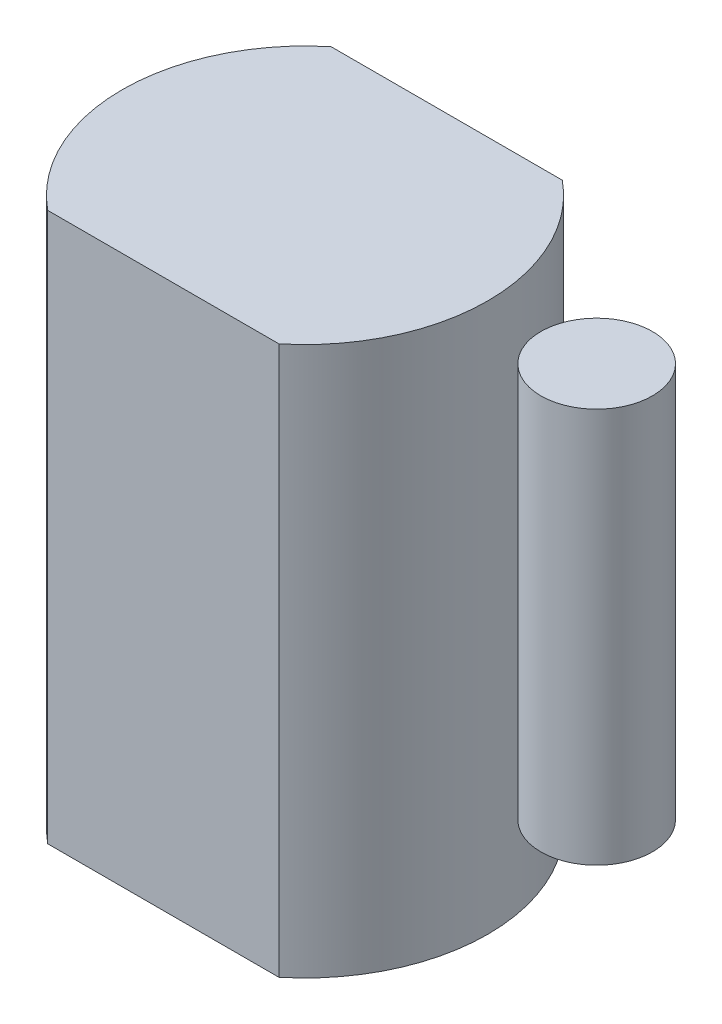
ISO-10303-21;
HEADER;
FILE_DESCRIPTION(('STEP AP214'),'2;1');
FILE_NAME('part.step','',(''),(''),'','','');
FILE_SCHEMA(('AUTOMOTIVE_DESIGN { 1 0 10303 214 1 1 1 1 }'));
ENDSEC;
DATA;
#1=APPLICATION_CONTEXT('core data for automotive mechanical design processes');
#2=APPLICATION_PROTOCOL_DEFINITION('international standard','automotive_design',2000,#1);
#3=PRODUCT_CONTEXT('',#1,'mechanical');
#4=PRODUCT('Part','Part','',(#3));
#5=PRODUCT_RELATED_PRODUCT_CATEGORY('part','',(#4));
#6=PRODUCT_DEFINITION_FORMATION('','',#4);
#7=PRODUCT_DEFINITION_CONTEXT('part definition',#1,'design');
#8=PRODUCT_DEFINITION('design','',#6,#7);
#9=PRODUCT_DEFINITION_SHAPE('','',#8);
#10=(LENGTH_UNIT() NAMED_UNIT(*) SI_UNIT(.MILLI.,.METRE.));
#11=(NAMED_UNIT(*) PLANE_ANGLE_UNIT() SI_UNIT($,.RADIAN.));
#12=(NAMED_UNIT(*) SI_UNIT($,.STERADIAN.) SOLID_ANGLE_UNIT());
#13=UNCERTAINTY_MEASURE_WITH_UNIT(LENGTH_MEASURE(1.E-05),#10,'distance_accuracy_value','');
#14=(GEOMETRIC_REPRESENTATION_CONTEXT(3) GLOBAL_UNCERTAINTY_ASSIGNED_CONTEXT((#13)) GLOBAL_UNIT_ASSIGNED_CONTEXT((#10,
#11,#12)) REPRESENTATION_CONTEXT('',''));
#15=CARTESIAN_POINT('',(0.,0.,0.));
#16=DIRECTION('',(0.,0.,1.));
#17=DIRECTION('',(1.,0.,0.));
#18=AXIS2_PLACEMENT_3D('',#15,#16,#17);
#19=CARTESIAN_POINT('',(15.95,8.4,0.));
#20=DIRECTION('',(0.,1.,0.));
#21=DIRECTION('',(0.,0.,1.));
#22=AXIS2_PLACEMENT_3D('',#19,#20,#21);
#23=CYLINDRICAL_SURFACE('',#22,3.05);
#24=CARTESIAN_POINT('',(15.95,8.4,0.));
#25=DIRECTION('',(0.,1.,0.));
#26=DIRECTION('',(0.,0.,1.));
#27=AXIS2_PLACEMENT_3D('',#24,#25,#26);
#28=CIRCLE('',#27,3.05);
#29=CARTESIAN_POINT('',(15.95,8.4,3.05));
#30=VERTEX_POINT('',#29);
#31=EDGE_CURVE('E11',#30,#30,#28,.T.);
#32=CARTESIAN_POINT('',(15.95,30.,0.));
#33=DIRECTION('',(0.,1.,0.));
#34=DIRECTION('',(0.,0.,1.));
#35=AXIS2_PLACEMENT_3D('',#32,#33,#34);
#36=CIRCLE('',#35,3.05);
#37=CARTESIAN_POINT('',(15.95,30.,3.05));
#38=VERTEX_POINT('',#37);
#39=EDGE_CURVE('E44',#38,#38,#36,.T.);
#40=CARTESIAN_POINT('',(15.95,8.4,3.05));
#41=CARTESIAN_POINT('',(15.95,8.62499999999999,3.05));
#42=CARTESIAN_POINT('',(15.95,8.85,3.05));
#43=CARTESIAN_POINT('',(15.95,9.3,3.05));
#44=CARTESIAN_POINT('',(15.95,9.525,3.05));
#45=CARTESIAN_POINT('',(15.95,9.975,3.05));
#46=CARTESIAN_POINT('',(15.95,10.2,3.05));
#47=CARTESIAN_POINT('',(15.95,10.65,3.05));
#48=CARTESIAN_POINT('',(15.95,10.875,3.05));
#49=CARTESIAN_POINT('',(15.95,11.325,3.05));
#50=CARTESIAN_POINT('',(15.95,11.55,3.05));
#51=CARTESIAN_POINT('',(15.95,12.,3.05));
#52=CARTESIAN_POINT('',(15.95,12.225,3.05));
#53=CARTESIAN_POINT('',(15.95,12.675,3.05));
#54=CARTESIAN_POINT('',(15.95,12.9,3.05));
#55=CARTESIAN_POINT('',(15.95,13.35,3.05));
#56=CARTESIAN_POINT('',(15.95,13.575,3.05));
#57=CARTESIAN_POINT('',(15.95,14.025,3.05));
#58=CARTESIAN_POINT('',(15.95,14.25,3.05));
#59=CARTESIAN_POINT('',(15.95,14.7,3.05));
#60=CARTESIAN_POINT('',(15.95,14.925,3.05));
#61=CARTESIAN_POINT('',(15.95,15.375,3.05));
#62=CARTESIAN_POINT('',(15.95,15.6,3.05));
#63=CARTESIAN_POINT('',(15.95,16.05,3.05));
#64=CARTESIAN_POINT('',(15.95,16.275,3.05));
#65=CARTESIAN_POINT('',(15.95,16.725,3.05));
#66=CARTESIAN_POINT('',(15.95,16.95,3.05));
#67=CARTESIAN_POINT('',(15.95,17.4,3.05));
#68=CARTESIAN_POINT('',(15.95,17.625,3.05));
#69=CARTESIAN_POINT('',(15.95,18.075,3.05));
#70=CARTESIAN_POINT('',(15.95,18.3,3.05));
#71=CARTESIAN_POINT('',(15.95,18.75,3.05));
#72=CARTESIAN_POINT('',(15.95,18.975,3.05));
#73=CARTESIAN_POINT('',(15.95,19.425,3.05));
#74=CARTESIAN_POINT('',(15.95,19.65,3.05));
#75=CARTESIAN_POINT('',(15.95,20.1,3.05));
#76=CARTESIAN_POINT('',(15.95,20.325,3.05));
#77=CARTESIAN_POINT('',(15.95,20.775,3.05));
#78=CARTESIAN_POINT('',(15.95,21.,3.05));
#79=CARTESIAN_POINT('',(15.95,21.45,3.05));
#80=CARTESIAN_POINT('',(15.95,21.675,3.05));
#81=CARTESIAN_POINT('',(15.95,22.125,3.05));
#82=CARTESIAN_POINT('',(15.95,22.35,3.05));
#83=CARTESIAN_POINT('',(15.95,22.8,3.05));
#84=CARTESIAN_POINT('',(15.95,23.025,3.05));
#85=CARTESIAN_POINT('',(15.95,23.475,3.05));
#86=CARTESIAN_POINT('',(15.95,23.7,3.05));
#87=CARTESIAN_POINT('',(15.95,24.15,3.05));
#88=CARTESIAN_POINT('',(15.95,24.375,3.05));
#89=CARTESIAN_POINT('',(15.95,24.825,3.05));
#90=CARTESIAN_POINT('',(15.95,25.05,3.05));
#91=CARTESIAN_POINT('',(15.95,25.5,3.05));
#92=CARTESIAN_POINT('',(15.95,25.725,3.05));
#93=CARTESIAN_POINT('',(15.95,26.175,3.05));
#94=CARTESIAN_POINT('',(15.95,26.4,3.05));
#95=CARTESIAN_POINT('',(15.95,26.85,3.05));
#96=CARTESIAN_POINT('',(15.95,27.075,3.05));
#97=CARTESIAN_POINT('',(15.95,27.525,3.05));
#98=CARTESIAN_POINT('',(15.95,27.75,3.05));
#99=CARTESIAN_POINT('',(15.95,28.2,3.05));
#100=CARTESIAN_POINT('',(15.95,28.425,3.05));
#101=CARTESIAN_POINT('',(15.95,28.875,3.05));
#102=CARTESIAN_POINT('',(15.95,29.1,3.05));
#103=CARTESIAN_POINT('',(15.95,29.55,3.05));
#104=CARTESIAN_POINT('',(15.95,29.775,3.05));
#105=CARTESIAN_POINT('',(15.95,30.,3.05));
#106=B_SPLINE_CURVE_WITH_KNOTS('',3,(#40,#41,#42,#43,#44,#45,#46,#47,#48,#49,#50,#51,#52,#53,
#54,#55,#56,#57,#58,#59,#60,#61,#62,#63,#64,#65,#66,#67,#68,#69,#70,#71,#72,#73,#74,#75,#76,#77,
#78,#79,#80,#81,#82,#83,#84,#85,#86,#87,#88,#89,#90,#91,#92,#93,#94,#95,#96,#97,#98,#99,#100,
#101,#102,#103,#104,#105),.UNSPECIFIED.,.F.,.F.,(4,2,2,2,2,2,2,2,2,2,2,2,2,2,2,2,2,2,2,2,2,2,2,
2,2,2,2,2,2,2,2,2,4),(0.,0.675,1.35,2.025,2.7,3.375,4.05,4.725,5.4,6.075,6.75,7.425,8.1,8.775,
9.45,10.125,10.8,11.475,12.15,12.825,13.5,14.175,14.85,15.525,16.2,16.875,17.55,18.225,18.9,
19.575,20.25,20.925,21.6),.UNSPECIFIED.);
#107=EDGE_CURVE('BSEAM41',#30,#38,#106,.T.);
#108=ORIENTED_EDGE('',*,*,#31,.T.);
#109=ORIENTED_EDGE('',*,*,#39,.F.);
#110=ORIENTED_EDGE('',*,*,#107,.T.);
#111=ORIENTED_EDGE('',*,*,#107,.F.);
#112=EDGE_LOOP('',(#108,#110,#109,#111));
#113=FACE_BOUND('',#112,.T.);
#114=ADVANCED_FACE('F41',(#113),#23,.T.);
#115=CARTESIAN_POINT('',(15.95,8.4,0.));
#116=DIRECTION('',(0.,1.,0.));
#117=DIRECTION('',(0.,0.,1.));
#118=AXIS2_PLACEMENT_3D('',#115,#116,#117);
#119=PLANE('',#118);
#120=ORIENTED_EDGE('',*,*,#31,.F.);
#121=EDGE_LOOP('',(#120));
#122=FACE_BOUND('',#121,.T.);
#123=ADVANCED_FACE('F56',(#122),#119,.F.);
#124=CARTESIAN_POINT('',(15.95,30.,0.));
#125=DIRECTION('',(0.,1.,0.));
#126=DIRECTION('',(0.,0.,1.));
#127=AXIS2_PLACEMENT_3D('',#124,#125,#126);
#128=PLANE('',#127);
#129=ORIENTED_EDGE('',*,*,#39,.T.);
#130=EDGE_LOOP('',(#129));
#131=FACE_BOUND('',#130,.T.);
#132=ADVANCED_FACE('F53',(#131),#128,.T.);
#133=CLOSED_SHELL('',(#114,#123,#132));
#134=MANIFOLD_SOLID_BREP('B2',#133);
#135=CARTESIAN_POINT('',(0.,30.,0.));
#136=DIRECTION('',(0.,-1.,0.));
#137=DIRECTION('',(0.,0.,-1.));
#138=AXIS2_PLACEMENT_3D('',#135,#136,#137);
#139=CYLINDRICAL_SURFACE('',#138,10.);
#140=CARTESIAN_POINT('',(0.,0.,0.));
#141=DIRECTION('',(0.,1.,0.));
#142=DIRECTION('',(0.,0.,-1.));
#143=AXIS2_PLACEMENT_3D('',#140,#141,#142);
#144=CIRCLE('',#143,10.);
#145=CARTESIAN_POINT('',(6.31961232988227,0.,7.75));
#146=VERTEX_POINT('',#145);
#147=CARTESIAN_POINT('',(6.31961232988227,0.,-7.75));
#148=VERTEX_POINT('',#147);
#149=EDGE_CURVE('E145',#146,#148,#144,.T.);
#150=ORIENTED_EDGE('',*,*,#149,.T.);
#151=DIRECTION('',(0.,-1.,0.));
#152=VECTOR('',#151,1.);
#153=CARTESIAN_POINT('',(6.31961232988227,30.,-7.75));
#154=LINE('',#153,#152);
#155=CARTESIAN_POINT('',(6.31961232988227,30.,-7.75));
#156=VERTEX_POINT('',#155);
#157=EDGE_CURVE('E39',#156,#148,#154,.T.);
#158=ORIENTED_EDGE('',*,*,#157,.F.);
#159=CARTESIAN_POINT('',(0.,30.,0.));
#160=DIRECTION('',(0.,1.,0.));
#161=DIRECTION('',(0.,0.,-1.));
#162=AXIS2_PLACEMENT_3D('',#159,#160,#161);
#163=CIRCLE('',#162,10.);
#164=CARTESIAN_POINT('',(6.31961232988227,30.,7.75));
#165=VERTEX_POINT('',#164);
#166=EDGE_CURVE('E133',#165,#156,#163,.T.);
#167=ORIENTED_EDGE('',*,*,#166,.F.);
#168=DIRECTION('',(0.,-1.,0.));
#169=VECTOR('',#168,1.);
#170=CARTESIAN_POINT('',(6.31961232988227,30.,7.75));
#171=LINE('',#170,#169);
#172=EDGE_CURVE('E141',#165,#146,#171,.T.);
#173=ORIENTED_EDGE('',*,*,#172,.T.);
#174=EDGE_LOOP('',(#150,#158,#167,#173));
#175=FACE_BOUND('',#174,.T.);
#176=ADVANCED_FACE('F82',(#175),#139,.T.);
#177=CARTESIAN_POINT('',(-6.31961232988227,30.,-7.75));
#178=DIRECTION('',(0.,0.,1.));
#179=DIRECTION('',(1.,0.,0.));
#180=AXIS2_PLACEMENT_3D('',#177,#178,#179);
#181=PLANE('',#180);
#182=DIRECTION('',(-1.,0.,0.));
#183=VECTOR('',#182,1.);
#184=CARTESIAN_POINT('',(-6.31961232988227,0.,-7.75));
#185=LINE('',#184,#183);
#186=CARTESIAN_POINT('',(-6.31961232988227,0.,-7.75));
#187=VERTEX_POINT('',#186);
#188=EDGE_CURVE('E137',#148,#187,#185,.T.);
#189=ORIENTED_EDGE('',*,*,#188,.T.);
#190=DIRECTION('',(0.,-1.,0.));
#191=VECTOR('',#190,1.);
#192=CARTESIAN_POINT('',(-6.31961232988227,30.,-7.75));
#193=LINE('',#192,#191);
#194=CARTESIAN_POINT('',(-6.31961232988227,30.,-7.75));
#195=VERTEX_POINT('',#194);
#196=EDGE_CURVE('E90',#195,#187,#193,.T.);
#197=ORIENTED_EDGE('',*,*,#196,.F.);
#198=DIRECTION('',(-1.,0.,0.));
#199=VECTOR('',#198,1.);
#200=CARTESIAN_POINT('',(-6.31961232988227,30.,-7.75));
#201=LINE('',#200,#199);
#202=EDGE_CURVE('E128',#156,#195,#201,.T.);
#203=ORIENTED_EDGE('',*,*,#202,.F.);
#204=ORIENTED_EDGE('',*,*,#157,.T.);
#205=EDGE_LOOP('',(#189,#197,#203,#204));
#206=FACE_BOUND('',#205,.T.);
#207=ADVANCED_FACE('F136',(#206),#181,.F.);
#208=CARTESIAN_POINT('',(0.,30.,0.));
#209=DIRECTION('',(0.,-1.,0.));
#210=DIRECTION('',(0.,0.,-1.));
#211=AXIS2_PLACEMENT_3D('',#208,#209,#210);
#212=CYLINDRICAL_SURFACE('',#211,10.);
#213=CARTESIAN_POINT('',(0.,0.,0.));
#214=DIRECTION('',(0.,1.,0.));
#215=DIRECTION('',(0.,0.,1.));
#216=AXIS2_PLACEMENT_3D('',#213,#214,#215);
#217=CIRCLE('',#216,10.);
#218=CARTESIAN_POINT('',(-6.31961232988227,0.,7.75));
#219=VERTEX_POINT('',#218);
#220=EDGE_CURVE('E115',#187,#219,#217,.T.);
#221=ORIENTED_EDGE('',*,*,#220,.T.);
#222=DIRECTION('',(0.,-1.,0.));
#223=VECTOR('',#222,1.);
#224=CARTESIAN_POINT('',(-6.31961232988227,30.,7.75));
#225=LINE('',#224,#223);
#226=CARTESIAN_POINT('',(-6.31961232988227,30.,7.75));
#227=VERTEX_POINT('',#226);
#228=EDGE_CURVE('E138',#227,#219,#225,.T.);
#229=ORIENTED_EDGE('',*,*,#228,.F.);
#230=CARTESIAN_POINT('',(0.,30.,0.));
#231=DIRECTION('',(0.,1.,0.));
#232=DIRECTION('',(0.,0.,1.));
#233=AXIS2_PLACEMENT_3D('',#230,#231,#232);
#234=CIRCLE('',#233,10.);
#235=EDGE_CURVE('E131',#195,#227,#234,.T.);
#236=ORIENTED_EDGE('',*,*,#235,.F.);
#237=ORIENTED_EDGE('',*,*,#196,.T.);
#238=EDGE_LOOP('',(#221,#229,#236,#237));
#239=FACE_BOUND('',#238,.T.);
#240=ADVANCED_FACE('F139',(#239),#212,.T.);
#241=CARTESIAN_POINT('',(-6.31961232988227,30.,7.75));
#242=DIRECTION('',(0.,0.,-1.));
#243=DIRECTION('',(-1.,0.,0.));
#244=AXIS2_PLACEMENT_3D('',#241,#242,#243);
#245=PLANE('',#244);
#246=DIRECTION('',(1.,0.,0.));
#247=VECTOR('',#246,1.);
#248=CARTESIAN_POINT('',(-6.31961232988227,0.,7.75));
#249=LINE('',#248,#247);
#250=EDGE_CURVE('E121',#219,#146,#249,.T.);
#251=ORIENTED_EDGE('',*,*,#250,.T.);
#252=ORIENTED_EDGE('',*,*,#172,.F.);
#253=DIRECTION('',(1.,0.,0.));
#254=VECTOR('',#253,1.);
#255=CARTESIAN_POINT('',(-6.31961232988227,30.,7.75));
#256=LINE('',#255,#254);
#257=EDGE_CURVE('E98',#227,#165,#256,.T.);
#258=ORIENTED_EDGE('',*,*,#257,.F.);
#259=ORIENTED_EDGE('',*,*,#228,.T.);
#260=EDGE_LOOP('',(#251,#252,#258,#259));
#261=FACE_BOUND('',#260,.T.);
#262=ADVANCED_FACE('F152',(#261),#245,.F.);
#263=CARTESIAN_POINT('',(0.,30.,0.));
#264=DIRECTION('',(0.,-1.,0.));
#265=DIRECTION('',(0.,0.,-1.));
#266=AXIS2_PLACEMENT_3D('',#263,#264,#265);
#267=PLANE('',#266);
#268=ORIENTED_EDGE('',*,*,#166,.T.);
#269=ORIENTED_EDGE('',*,*,#202,.T.);
#270=ORIENTED_EDGE('',*,*,#235,.T.);
#271=ORIENTED_EDGE('',*,*,#257,.T.);
#272=EDGE_LOOP('',(#268,#269,#270,#271));
#273=FACE_BOUND('',#272,.T.);
#274=ADVANCED_FACE('F129',(#273),#267,.F.);
#275=CARTESIAN_POINT('',(0.,0.,0.));
#276=DIRECTION('',(0.,-1.,0.));
#277=DIRECTION('',(0.,0.,-1.));
#278=AXIS2_PLACEMENT_3D('',#275,#276,#277);
#279=PLANE('',#278);
#280=ORIENTED_EDGE('',*,*,#149,.F.);
#281=ORIENTED_EDGE('',*,*,#250,.F.);
#282=ORIENTED_EDGE('',*,*,#220,.F.);
#283=ORIENTED_EDGE('',*,*,#188,.F.);
#284=EDGE_LOOP('',(#280,#281,#282,#283));
#285=FACE_BOUND('',#284,.T.);
#286=ADVANCED_FACE('F155',(#285),#279,.T.);
#287=CLOSED_SHELL('',(#176,#207,#240,#262,#274,#286));
#288=MANIFOLD_SOLID_BREP('B6',#287);
#289=ADVANCED_BREP_SHAPE_REPRESENTATION('',(#18,#134,#288),#14);
#290=SHAPE_DEFINITION_REPRESENTATION(#9,#289);
ENDSEC;
END-ISO-10303-21;
